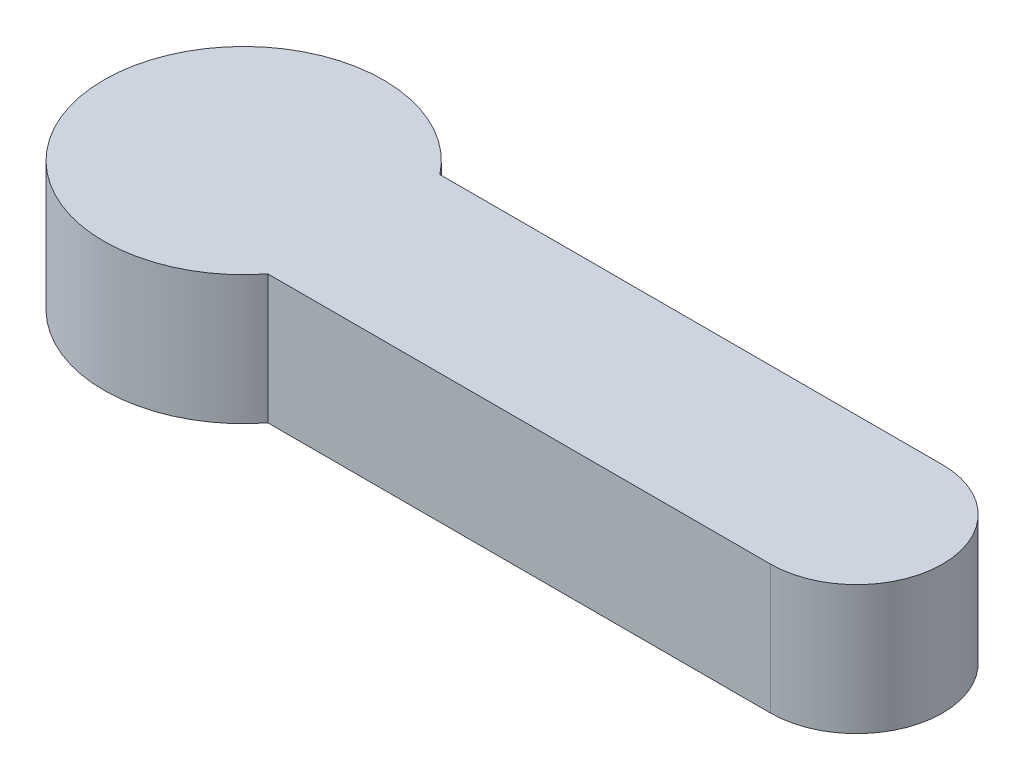
ISO-10303-21;
HEADER;
FILE_DESCRIPTION(('STEP AP214'),'2;1');
FILE_NAME('part.step','',(''),(''),'','','');
FILE_SCHEMA(('AUTOMOTIVE_DESIGN { 1 0 10303 214 1 1 1 1 }'));
ENDSEC;
DATA;
#1=APPLICATION_CONTEXT('core data for automotive mechanical design processes');
#2=APPLICATION_PROTOCOL_DEFINITION('international standard','automotive_design',2000,#1);
#3=PRODUCT_CONTEXT('',#1,'mechanical');
#4=PRODUCT('Part','Part','',(#3));
#5=PRODUCT_RELATED_PRODUCT_CATEGORY('part','',(#4));
#6=PRODUCT_DEFINITION_FORMATION('','',#4);
#7=PRODUCT_DEFINITION_CONTEXT('part definition',#1,'design');
#8=PRODUCT_DEFINITION('design','',#6,#7);
#9=PRODUCT_DEFINITION_SHAPE('','',#8);
#10=(LENGTH_UNIT() NAMED_UNIT(*) SI_UNIT(.MILLI.,.METRE.));
#11=(NAMED_UNIT(*) PLANE_ANGLE_UNIT() SI_UNIT($,.RADIAN.));
#12=(NAMED_UNIT(*) SI_UNIT($,.STERADIAN.) SOLID_ANGLE_UNIT());
#13=UNCERTAINTY_MEASURE_WITH_UNIT(LENGTH_MEASURE(1.E-05),#10,'distance_accuracy_value','');
#14=(GEOMETRIC_REPRESENTATION_CONTEXT(3) GLOBAL_UNCERTAINTY_ASSIGNED_CONTEXT((#13)) GLOBAL_UNIT_ASSIGNED_CONTEXT((#10,
#11,#12)) REPRESENTATION_CONTEXT('',''));
#15=CARTESIAN_POINT('',(0.,0.,0.));
#16=DIRECTION('',(0.,0.,1.));
#17=DIRECTION('',(1.,0.,0.));
#18=AXIS2_PLACEMENT_3D('',#15,#16,#17);
#19=CARTESIAN_POINT('',(52.5,22.,-85.));
#20=DIRECTION('',(0.,-1.,0.));
#21=DIRECTION('',(1.,0.,0.));
#22=AXIS2_PLACEMENT_3D('',#19,#20,#21);
#23=CYLINDRICAL_SURFACE('',#22,6.5);
#24=DIRECTION('',(0.,-1.,0.));
#25=VECTOR('',#24,1.);
#26=CARTESIAN_POINT('',(57.62347538298,22.,-81.));
#27=LINE('',#26,#25);
#28=CARTESIAN_POINT('',(57.62347538298,28.,-81.));
#29=VERTEX_POINT('',#28);
#30=CARTESIAN_POINT('',(57.62347538298,22.,-81.));
#31=VERTEX_POINT('',#30);
#32=EDGE_CURVE('E11',#29,#31,#27,.T.);
#33=ORIENTED_EDGE('',*,*,#32,.F.);
#34=CARTESIAN_POINT('',(52.5,28.,-85.));
#35=DIRECTION('',(0.,1.,0.));
#36=DIRECTION('',(1.,0.,0.));
#37=AXIS2_PLACEMENT_3D('',#34,#35,#36);
#38=CIRCLE('',#37,6.5);
#39=CARTESIAN_POINT('',(57.62347538298,28.,-89.));
#40=VERTEX_POINT('',#39);
#41=EDGE_CURVE('E20',#40,#29,#38,.T.);
#42=ORIENTED_EDGE('',*,*,#41,.F.);
#43=DIRECTION('',(0.,-1.,0.));
#44=VECTOR('',#43,1.);
#45=CARTESIAN_POINT('',(57.62347538298,22.,-89.));
#46=LINE('',#45,#44);
#47=CARTESIAN_POINT('',(57.62347538298,22.,-89.));
#48=VERTEX_POINT('',#47);
#49=EDGE_CURVE('E79',#40,#48,#46,.T.);
#50=ORIENTED_EDGE('',*,*,#49,.T.);
#51=CARTESIAN_POINT('',(52.5,22.,-85.));
#52=DIRECTION('',(0.,1.,0.));
#53=DIRECTION('',(1.,0.,0.));
#54=AXIS2_PLACEMENT_3D('',#51,#52,#53);
#55=CIRCLE('',#54,6.5);
#56=EDGE_CURVE('E83',#48,#31,#55,.T.);
#57=ORIENTED_EDGE('',*,*,#56,.T.);
#58=EDGE_LOOP('',(#33,#42,#50,#57));
#59=FACE_BOUND('',#58,.T.);
#60=ADVANCED_FACE('F17',(#59),#23,.T.);
#61=CARTESIAN_POINT('',(52.5,22.,-81.));
#62=DIRECTION('',(0.,0.,-1.));
#63=DIRECTION('',(-1.,0.,0.));
#64=AXIS2_PLACEMENT_3D('',#61,#62,#63);
#65=PLANE('',#64);
#66=DIRECTION('',(0.,1.,0.));
#67=VECTOR('',#66,1.);
#68=CARTESIAN_POINT('',(81.,22.,-81.));
#69=LINE('',#68,#67);
#70=CARTESIAN_POINT('',(81.,22.,-81.));
#71=VERTEX_POINT('',#70);
#72=CARTESIAN_POINT('',(81.,28.,-81.));
#73=VERTEX_POINT('',#72);
#74=EDGE_CURVE('E30',#71,#73,#69,.T.);
#75=ORIENTED_EDGE('',*,*,#74,.T.);
#76=DIRECTION('',(1.,0.,0.));
#77=VECTOR('',#76,1.);
#78=CARTESIAN_POINT('',(52.5,28.,-81.));
#79=LINE('',#78,#77);
#80=EDGE_CURVE('E64',#29,#73,#79,.T.);
#81=ORIENTED_EDGE('',*,*,#80,.F.);
#82=ORIENTED_EDGE('',*,*,#32,.T.);
#83=DIRECTION('',(1.,0.,0.));
#84=VECTOR('',#83,1.);
#85=CARTESIAN_POINT('',(52.5,22.,-81.));
#86=LINE('',#85,#84);
#87=EDGE_CURVE('E103',#31,#71,#86,.T.);
#88=ORIENTED_EDGE('',*,*,#87,.T.);
#89=EDGE_LOOP('',(#75,#81,#82,#88));
#90=FACE_BOUND('',#89,.T.);
#91=ADVANCED_FACE('F92',(#90),#65,.F.);
#92=CARTESIAN_POINT('',(81.,22.,-85.));
#93=DIRECTION('',(0.,-1.,0.));
#94=DIRECTION('',(1.,0.,0.));
#95=AXIS2_PLACEMENT_3D('',#92,#93,#94);
#96=CYLINDRICAL_SURFACE('',#95,4.);
#97=DIRECTION('',(0.,1.,0.));
#98=VECTOR('',#97,1.);
#99=CARTESIAN_POINT('',(81.,22.,-89.));
#100=LINE('',#99,#98);
#101=CARTESIAN_POINT('',(81.,22.,-89.));
#102=VERTEX_POINT('',#101);
#103=CARTESIAN_POINT('',(81.,28.,-89.));
#104=VERTEX_POINT('',#103);
#105=EDGE_CURVE('E69',#102,#104,#100,.T.);
#106=ORIENTED_EDGE('',*,*,#105,.T.);
#107=CARTESIAN_POINT('',(81.,28.,-85.));
#108=DIRECTION('',(0.,1.,0.));
#109=DIRECTION('',(0.,0.,1.));
#110=AXIS2_PLACEMENT_3D('',#107,#108,#109);
#111=CIRCLE('',#110,4.);
#112=EDGE_CURVE('E57',#73,#104,#111,.T.);
#113=ORIENTED_EDGE('',*,*,#112,.F.);
#114=ORIENTED_EDGE('',*,*,#74,.F.);
#115=CARTESIAN_POINT('',(81.,22.,-85.));
#116=DIRECTION('',(0.,-1.,0.));
#117=DIRECTION('',(0.,0.,-1.));
#118=AXIS2_PLACEMENT_3D('',#115,#116,#117);
#119=CIRCLE('',#118,4.);
#120=EDGE_CURVE('E71',#102,#71,#119,.T.);
#121=ORIENTED_EDGE('',*,*,#120,.F.);
#122=EDGE_LOOP('',(#106,#113,#114,#121));
#123=FACE_BOUND('',#122,.T.);
#124=ADVANCED_FACE('F66',(#123),#96,.T.);
#125=CARTESIAN_POINT('',(66.75,28.,-85.));
#126=DIRECTION('',(0.,1.,0.));
#127=DIRECTION('',(0.,0.,-1.));
#128=AXIS2_PLACEMENT_3D('',#125,#126,#127);
#129=PLANE('',#128);
#130=ORIENTED_EDGE('',*,*,#80,.T.);
#131=ORIENTED_EDGE('',*,*,#112,.T.);
#132=DIRECTION('',(-1.,0.,0.));
#133=VECTOR('',#132,1.);
#134=CARTESIAN_POINT('',(81.,28.,-89.));
#135=LINE('',#134,#133);
#136=EDGE_CURVE('E61',#104,#40,#135,.T.);
#137=ORIENTED_EDGE('',*,*,#136,.T.);
#138=ORIENTED_EDGE('',*,*,#41,.T.);
#139=EDGE_LOOP('',(#130,#131,#137,#138));
#140=FACE_BOUND('',#139,.T.);
#141=ADVANCED_FACE('F59',(#140),#129,.T.);
#142=CARTESIAN_POINT('',(81.,22.,-89.));
#143=DIRECTION('',(0.,0.,1.));
#144=DIRECTION('',(0.,-1.,0.));
#145=AXIS2_PLACEMENT_3D('',#142,#143,#144);
#146=PLANE('',#145);
#147=ORIENTED_EDGE('',*,*,#49,.F.);
#148=ORIENTED_EDGE('',*,*,#136,.F.);
#149=ORIENTED_EDGE('',*,*,#105,.F.);
#150=DIRECTION('',(-1.,0.,0.));
#151=VECTOR('',#150,1.);
#152=CARTESIAN_POINT('',(81.,22.,-89.));
#153=LINE('',#152,#151);
#154=EDGE_CURVE('E115',#102,#48,#153,.T.);
#155=ORIENTED_EDGE('',*,*,#154,.T.);
#156=EDGE_LOOP('',(#147,#148,#149,#155));
#157=FACE_BOUND('',#156,.T.);
#158=ADVANCED_FACE('F77',(#157),#146,.F.);
#159=CARTESIAN_POINT('',(52.5,22.,-85.));
#160=DIRECTION('',(0.,1.,0.));
#161=DIRECTION('',(0.,0.,-1.));
#162=AXIS2_PLACEMENT_3D('',#159,#160,#161);
#163=PLANE('',#162);
#164=ORIENTED_EDGE('',*,*,#154,.F.);
#165=ORIENTED_EDGE('',*,*,#120,.T.);
#166=ORIENTED_EDGE('',*,*,#87,.F.);
#167=ORIENTED_EDGE('',*,*,#56,.F.);
#168=EDGE_LOOP('',(#164,#165,#166,#167));
#169=FACE_BOUND('',#168,.T.);
#170=ADVANCED_FACE('F118',(#169),#163,.F.);
#171=CLOSED_SHELL('',(#60,#91,#124,#141,#158,#170));
#172=MANIFOLD_SOLID_BREP('B1',#171);
#173=ADVANCED_BREP_SHAPE_REPRESENTATION('',(#18,#172),#14);
#174=SHAPE_DEFINITION_REPRESENTATION(#9,#173);
ENDSEC;
END-ISO-10303-21;
